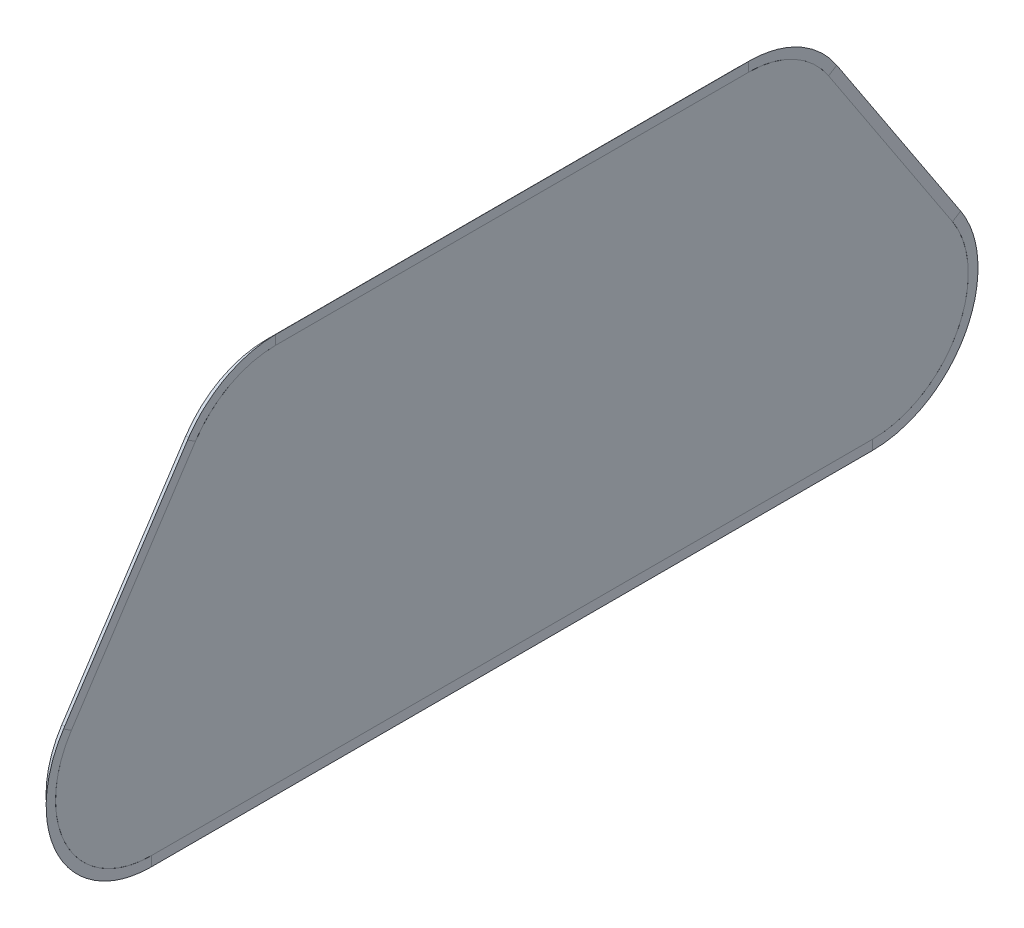
ISO-10303-21;
HEADER;
FILE_DESCRIPTION(('STEP AP214'),'2;1');
FILE_NAME('part.step','',(''),(''),'','','');
FILE_SCHEMA(('AUTOMOTIVE_DESIGN { 1 0 10303 214 1 1 1 1 }'));
ENDSEC;
DATA;
#1=APPLICATION_CONTEXT('core data for automotive mechanical design processes');
#2=APPLICATION_PROTOCOL_DEFINITION('international standard','automotive_design',2000,#1);
#3=PRODUCT_CONTEXT('',#1,'mechanical');
#4=PRODUCT('Part','Part','',(#3));
#5=PRODUCT_RELATED_PRODUCT_CATEGORY('part','',(#4));
#6=PRODUCT_DEFINITION_FORMATION('','',#4);
#7=PRODUCT_DEFINITION_CONTEXT('part definition',#1,'design');
#8=PRODUCT_DEFINITION('design','',#6,#7);
#9=PRODUCT_DEFINITION_SHAPE('','',#8);
#10=(LENGTH_UNIT() NAMED_UNIT(*) SI_UNIT(.MILLI.,.METRE.));
#11=(NAMED_UNIT(*) PLANE_ANGLE_UNIT() SI_UNIT($,.RADIAN.));
#12=(NAMED_UNIT(*) SI_UNIT($,.STERADIAN.) SOLID_ANGLE_UNIT());
#13=UNCERTAINTY_MEASURE_WITH_UNIT(LENGTH_MEASURE(1.E-05),#10,'distance_accuracy_value','');
#14=(GEOMETRIC_REPRESENTATION_CONTEXT(3) GLOBAL_UNCERTAINTY_ASSIGNED_CONTEXT((#13)) GLOBAL_UNIT_ASSIGNED_CONTEXT((#10,
#11,#12)) REPRESENTATION_CONTEXT('',''));
#15=CARTESIAN_POINT('',(0.,0.,0.));
#16=DIRECTION('',(0.,0.,1.));
#17=DIRECTION('',(1.,0.,0.));
#18=AXIS2_PLACEMENT_3D('',#15,#16,#17);
#19=CARTESIAN_POINT('',(222.,47.3671548351233,-10.544114440503));
#20=CARTESIAN_POINT('',(222.034904812875,49.3668502254361,-10.544114440503));
#21=CARTESIAN_POINT('',(222.,47.3671548351233,-10.1469887777139));
#22=CARTESIAN_POINT('',(222.034904812874,49.3593817909838,-10.1075705196872));
#23=CARTESIAN_POINT('',(222.,47.343393296283,-9.34743837210346));
#24=CARTESIAN_POINT('',(222.034904812874,49.3444449220792,-9.23448267805566));
#25=CARTESIAN_POINT('',(222.,47.1980460977618,-7.73366449790399));
#26=CARTESIAN_POINT('',(222.034904812875,49.1802646931181,-7.46443837044333));
#27=CARTESIAN_POINT('',(222.,46.6751620014668,-4.88118267092727));
#28=CARTESIAN_POINT('',(222.034904812874,48.6159810452897,-4.35028259738964));
#29=CARTESIAN_POINT('',(222.,45.1633562274969,-0.959543207699794));
#30=CARTESIAN_POINT('',(222.034904812875,46.9444905687506,-0.000270574594239402));
#31=CARTESIAN_POINT('',(222.,42.7209172377154,2.46088140906158));
#32=CARTESIAN_POINT('',(222.034904812875,44.2322549281824,3.78922317017646));
#33=CARTESIAN_POINT('',(222.,40.6269637317133,4.46722611177145));
#34=CARTESIAN_POINT('',(222.034904812875,41.9425972953211,5.97413738779009));
#35=CARTESIAN_POINT('',(222.,39.3595162459252,5.47666595442486));
#36=CARTESIAN_POINT('',(222.034904812874,40.5550345716577,7.08529970104253));
#37=CARTESIAN_POINT('',(222.,38.7050012510926,5.93650895304427));
#38=CARTESIAN_POINT('',(222.034904812874,39.8342625491415,7.57824308604266));
#39=CARTESIAN_POINT('',(222.,38.373417865557,6.15505242808387));
#40=CARTESIAN_POINT('',(222.034904812875,39.4738765378834,7.82471477854273));
#41=(BOUNDED_SURFACE() B_SPLINE_SURFACE(3,1,((#19,#20),(#21,#22),(#23,#24),(#25,#26),(#27,#28),
(#29,#30),(#31,#32),(#33,#34),(#35,#36),(#37,#38),(#39,#40)),.UNSPECIFIED.,.F.,.F.,
.F.) B_SPLINE_SURFACE_WITH_KNOTS((4,1,1,1,1,1,1,1,4),(2,2),(0.,0.0625,0.125,0.25,0.5,0.75,0.875,
0.9375,1.),(0.,1.),
.UNSPECIFIED.) GEOMETRIC_REPRESENTATION_ITEM() RATIONAL_B_SPLINE_SURFACE(((1.,1.),
(0.995017906985336,1.),(0.985676482582842,1.),(0.969484680285185,1.),(0.947688023346032,1.),
(0.935232790809373,1.),(0.947688023346032,1.),(0.969484680285185,1.),(0.985676482582842,1.),
(0.995017906985336,1.),(1.,1.))) REPRESENTATION_ITEM('') SURFACE());
#42=CARTESIAN_POINT('',(222.,47.3671548351233,-10.544114440503));
#43=CARTESIAN_POINT('',(222.,47.3671548351233,-10.1469887777139));
#44=CARTESIAN_POINT('',(222.,47.343393296283,-9.34743837210346));
#45=CARTESIAN_POINT('',(222.,47.1980460977618,-7.73366449790399));
#46=CARTESIAN_POINT('',(222.,46.6751620014668,-4.88118267092727));
#47=CARTESIAN_POINT('',(222.,45.1633562274969,-0.959543207699794));
#48=CARTESIAN_POINT('',(222.,42.7209172377154,2.46088140906158));
#49=CARTESIAN_POINT('',(222.,40.6269637317133,4.46722611177145));
#50=CARTESIAN_POINT('',(222.,39.3595162459252,5.47666595442486));
#51=CARTESIAN_POINT('',(222.,38.7050012510926,5.93650895304427));
#52=CARTESIAN_POINT('',(222.,38.373417865557,6.15505242808387));
#53=(BOUNDED_CURVE() B_SPLINE_CURVE(3,(#42,#43,#44,#45,#46,#47,#48,#49,#50,#51,#52),
.UNSPECIFIED.,.F.,.F.) B_SPLINE_CURVE_WITH_KNOTS((4,1,1,1,1,1,1,1,4),(0.,0.0625,0.125,0.25,0.5,
0.75,0.875,0.9375,1.),
.UNSPECIFIED.) CURVE() GEOMETRIC_REPRESENTATION_ITEM() RATIONAL_B_SPLINE_CURVE((1.,
0.995017906985336,0.985676482582842,0.969484680285185,0.947688023346032,0.935232790809373,
0.947688023346032,0.969484680285185,0.985676482582842,0.995017906985336,1.)) REPRESENTATION_ITEM(''));
#54=CARTESIAN_POINT('',(222.,47.3671548351233,-10.544114440503));
#55=VERTEX_POINT('',#54);
#56=CARTESIAN_POINT('',(222.,38.373417865557,6.15505242808387));
#57=VERTEX_POINT('',#56);
#58=EDGE_CURVE('E542',#55,#57,#53,.T.);
#59=DIRECTION('',(0.0174524064372739,0.550229336163204,0.834831175229428));
#60=VECTOR('',#59,1.);
#61=CARTESIAN_POINT('',(222.017452406437,38.9236472017202,6.9898836033133));
#62=LINE('',#61,#60);
#63=CARTESIAN_POINT('',(222.034904812875,39.4738765378834,7.82471477854273));
#64=VERTEX_POINT('',#63);
#65=EDGE_CURVE('E525',#57,#64,#62,.T.);
#66=CARTESIAN_POINT('',(222.034904812875,49.3668502254361,-10.544114440503));
#67=CARTESIAN_POINT('',(222.034904812874,49.3593817909838,-10.1075705196872));
#68=CARTESIAN_POINT('',(222.034904812874,49.3444449220792,-9.23448267805566));
#69=CARTESIAN_POINT('',(222.034904812875,49.1802646931181,-7.46443837044333));
#70=CARTESIAN_POINT('',(222.034904812874,48.6159810452897,-4.35028259738964));
#71=CARTESIAN_POINT('',(222.034904812875,46.9444905687506,-0.000270574594239402));
#72=CARTESIAN_POINT('',(222.034904812875,44.2322549281824,3.78922317017646));
#73=CARTESIAN_POINT('',(222.034904812875,41.9425972953211,5.97413738779009));
#74=CARTESIAN_POINT('',(222.034904812874,40.5550345716577,7.08529970104253));
#75=CARTESIAN_POINT('',(222.034904812874,39.8342625491415,7.57824308604266));
#76=CARTESIAN_POINT('',(222.034904812875,39.4738765378834,7.82471477854273));
#77=B_SPLINE_CURVE_WITH_KNOTS('',3,(#66,#67,#68,#69,#70,#71,#72,#73,#74,#75,#76),.UNSPECIFIED.,
.F.,.F.,(4,1,1,1,1,1,1,1,4),(0.,0.0625,0.125,0.25,0.5,0.75,0.875,0.9375,1.),.UNSPECIFIED.);
#78=CARTESIAN_POINT('',(222.034904812875,49.3668502254361,-10.544114440503));
#79=VERTEX_POINT('',#78);
#80=EDGE_CURVE('E370',#64,#79,#77,.F.);
#81=DIRECTION('',(-0.0174524064372738,-0.999847695156391,0.));
#82=VECTOR('',#81,1.);
#83=CARTESIAN_POINT('',(222.017452406437,48.3670025302797,-10.544114440503));
#84=LINE('',#83,#82);
#85=EDGE_CURVE('E13',#79,#55,#84,.T.);
#86=ORIENTED_EDGE('',*,*,#58,.T.);
#87=ORIENTED_EDGE('',*,*,#65,.T.);
#88=ORIENTED_EDGE('',*,*,#80,.T.);
#89=ORIENTED_EDGE('',*,*,#85,.T.);
#90=EDGE_LOOP('',(#86,#87,#88,#89));
#91=FACE_BOUND('',#90,.T.);
#92=ADVANCED_FACE('F357',(#91),#41,.T.);
#93=CARTESIAN_POINT('',(222.,47.3671548351233,-109.327040639233));
#94=DIRECTION('',(-0.999847695156391,0.0174524064372738,0.));
#95=DIRECTION('',(0.,0.,1.));
#96=AXIS2_PLACEMENT_3D('',#93,#94,#95);
#97=PLANE('',#96);
#98=DIRECTION('',(0.,0.,1.));
#99=VECTOR('',#98,1.);
#100=CARTESIAN_POINT('',(222.,47.3671548351233,-59.9355775398678));
#101=LINE('',#100,#99);
#102=CARTESIAN_POINT('',(222.,47.3671548351233,-109.327040639233));
#103=VERTEX_POINT('',#102);
#104=EDGE_CURVE('E379',#103,#55,#101,.T.);
#105=ORIENTED_EDGE('',*,*,#104,.T.);
#106=ORIENTED_EDGE('',*,*,#85,.F.);
#107=DIRECTION('',(0.,0.,-1.));
#108=VECTOR('',#107,1.);
#109=CARTESIAN_POINT('',(222.034904812875,49.3668502254361,-59.9355775398678));
#110=LINE('',#109,#108);
#111=CARTESIAN_POINT('',(222.034904812875,49.3668502254361,-109.327040639233));
#112=VERTEX_POINT('',#111);
#113=EDGE_CURVE('E543',#79,#112,#110,.T.);
#114=ORIENTED_EDGE('',*,*,#113,.T.);
#115=DIRECTION('',(-0.0174524064372738,-0.999847695156391,0.));
#116=VECTOR('',#115,1.);
#117=CARTESIAN_POINT('',(222.017452406437,48.3670025302797,-109.327040639233));
#118=LINE('',#117,#116);
#119=EDGE_CURVE('E538',#112,#103,#118,.T.);
#120=ORIENTED_EDGE('',*,*,#119,.T.);
#121=EDGE_LOOP('',(#105,#106,#114,#120));
#122=FACE_BOUND('',#121,.T.);
#123=ADVANCED_FACE('F625',(#122),#97,.T.);
#124=CARTESIAN_POINT('',(222.,38.373417865557,6.15505242808387));
#125=DIRECTION('',(-0.999847695156391,0.00960428878813346,0.0145720323677218));
#126=DIRECTION('',(0.,-0.834958343429344,0.550313151521682));
#127=AXIS2_PLACEMENT_3D('',#124,#125,#126);
#128=PLANE('',#127);
#129=DIRECTION('',(0.,-0.834958343429344,0.550313151521682));
#130=VECTOR('',#129,1.);
#131=CARTESIAN_POINT('',(222.,18.7230554542372,19.1064205438894));
#132=LINE('',#131,#130);
#133=CARTESIAN_POINT('',(222.,-0.927306957082626,32.0577886596949));
#134=VERTEX_POINT('',#133);
#135=EDGE_CURVE('E502',#57,#134,#132,.T.);
#136=ORIENTED_EDGE('',*,*,#135,.T.);
#137=DIRECTION('',(0.0174524064372738,0.550229336163203,0.834831175229429));
#138=VECTOR('',#137,1.);
#139=CARTESIAN_POINT('',(222.017452406437,-0.377077620919421,32.8926198349243));
#140=LINE('',#139,#138);
#141=CARTESIAN_POINT('',(222.034904812875,0.17315171524378,33.7274510101537));
#142=VERTEX_POINT('',#141);
#143=EDGE_CURVE('E496',#134,#142,#140,.T.);
#144=ORIENTED_EDGE('',*,*,#143,.T.);
#145=DIRECTION('',(0.,0.834958343429344,-0.550313151521682));
#146=VECTOR('',#145,1.);
#147=CARTESIAN_POINT('',(222.034904812875,19.8235141265636,20.7760828943482));
#148=LINE('',#147,#146);
#149=EDGE_CURVE('E501',#142,#64,#148,.T.);
#150=ORIENTED_EDGE('',*,*,#149,.T.);
#151=ORIENTED_EDGE('',*,*,#65,.F.);
#152=EDGE_LOOP('',(#136,#144,#150,#151));
#153=FACE_BOUND('',#152,.T.);
#154=ADVANCED_FACE('F600',(#153),#128,.T.);
#155=CARTESIAN_POINT('',(222.,38.363087517325,-126.033011561286));
#156=CARTESIAN_POINT('',(222.034904812875,39.4625133121644,-127.703354213462));
#157=CARTESIAN_POINT('',(222.,38.69499849861,-125.814546509256));
#158=CARTESIAN_POINT('',(222.034904812875,39.8232582759278,-127.456959217031));
#159=CARTESIAN_POINT('',(222.,39.3501756336238,-125.354826519129));
#160=CARTESIAN_POINT('',(222.034904812874,40.5447482034547,-126.964169224169));
#161=CARTESIAN_POINT('',(222.,40.6189612817587,-124.345493577547));
#162=CARTESIAN_POINT('',(222.034904812875,41.9337732370248,-125.853122734842));
#163=CARTESIAN_POINT('',(222.,42.715265497387,-122.338946246436));
#164=CARTESIAN_POINT('',(222.034904812875,44.2259780773546,-123.668021113326));
#165=CARTESIAN_POINT('',(222.,45.1606374593197,-118.917247405057));
#166=CARTESIAN_POINT('',(222.034904812874,46.9415053144157,-119.877087101067));
#167=CARTESIAN_POINT('',(222.,46.6743202529073,-114.993393254645));
#168=CARTESIAN_POINT('',(222.034904812875,48.615079248456,-115.524568387975));
#169=CARTESIAN_POINT('',(222.,47.1978453194475,-112.139160422315));
#170=CARTESIAN_POINT('',(222.034904812875,49.1800449500906,-112.40853150078));
#171=CARTESIAN_POINT('',(222.,47.3433655793325,-110.524417761134));
#172=CARTESIAN_POINT('',(222.034904812875,49.3444191791267,-110.637431289567));
#173=CARTESIAN_POINT('',(222.,47.3671548351233,-109.724396749612));
#174=CARTESIAN_POINT('',(222.034904812874,49.3593732099996,-109.763837522677));
#175=CARTESIAN_POINT('',(222.,47.3671548351233,-109.327040639233));
#176=CARTESIAN_POINT('',(222.034904812875,49.3668502254361,-109.327040639233));
#177=(BOUNDED_SURFACE() B_SPLINE_SURFACE(3,1,((#155,#156),(#157,#158),(#159,#160),(#161,#162),
(#163,#164),(#165,#166),(#167,#168),(#169,#170),(#171,#172),(#173,#174),(#175,#176)),
.UNSPECIFIED.,.F.,.F.,.F.) B_SPLINE_SURFACE_WITH_KNOTS((4,1,1,1,1,1,1,1,4),(2,2),(0.,0.0625,
0.125,0.25,0.5,0.75,0.875,0.9375,1.),(0.,1.),
.UNSPECIFIED.) GEOMETRIC_REPRESENTATION_ITEM() RATIONAL_B_SPLINE_SURFACE(((1.,1.),
(0.995011795381524,1.),(0.985658911721881,1.),(0.969447246711834,1.),(0.947623851506001,1.),
(0.935153339959811,1.),(0.947623851506001,1.),(0.969447246711834,1.),(0.985658911721881,1.),
(0.995011795381524,1.),(1.,1.))) REPRESENTATION_ITEM('') SURFACE());
#178=CARTESIAN_POINT('',(222.,38.363087517325,-126.033011561286));
#179=CARTESIAN_POINT('',(222.,38.69499849861,-125.814546509256));
#180=CARTESIAN_POINT('',(222.,39.3501756336238,-125.354826519129));
#181=CARTESIAN_POINT('',(222.,40.6189612817587,-124.345493577547));
#182=CARTESIAN_POINT('',(222.,42.715265497387,-122.338946246436));
#183=CARTESIAN_POINT('',(222.,45.1606374593197,-118.917247405057));
#184=CARTESIAN_POINT('',(222.,46.6743202529073,-114.993393254645));
#185=CARTESIAN_POINT('',(222.,47.1978453194475,-112.139160422315));
#186=CARTESIAN_POINT('',(222.,47.3433655793325,-110.524417761134));
#187=CARTESIAN_POINT('',(222.,47.3671548351233,-109.724396749612));
#188=CARTESIAN_POINT('',(222.,47.3671548351233,-109.327040639233));
#189=(BOUNDED_CURVE() B_SPLINE_CURVE(3,(#178,#179,#180,#181,#182,#183,#184,#185,#186,#187,#188),
.UNSPECIFIED.,.F.,.F.) B_SPLINE_CURVE_WITH_KNOTS((4,1,1,1,1,1,1,1,4),(0.,0.0625,0.125,0.25,0.5,
0.75,0.875,0.9375,1.),
.UNSPECIFIED.) CURVE() GEOMETRIC_REPRESENTATION_ITEM() RATIONAL_B_SPLINE_CURVE((1.,
0.995011795381524,0.985658911721881,0.969447246711834,0.947623851506001,0.935153339959811,
0.947623851506001,0.969447246711834,0.985658911721881,0.995011795381524,1.)) REPRESENTATION_ITEM(''));
#190=CARTESIAN_POINT('',(222.,38.363087517325,-126.033011561286));
#191=VERTEX_POINT('',#190);
#192=EDGE_CURVE('E533',#191,#103,#189,.T.);
#193=CARTESIAN_POINT('',(222.034904812875,39.4625133121644,-127.703354213462));
#194=CARTESIAN_POINT('',(222.034904812875,39.8232582759278,-127.456959217031));
#195=CARTESIAN_POINT('',(222.034904812874,40.5447482034547,-126.964169224169));
#196=CARTESIAN_POINT('',(222.034904812875,41.9337732370248,-125.853122734842));
#197=CARTESIAN_POINT('',(222.034904812875,44.2259780773546,-123.668021113326));
#198=CARTESIAN_POINT('',(222.034904812874,46.9415053144157,-119.877087101067));
#199=CARTESIAN_POINT('',(222.034904812875,48.615079248456,-115.524568387975));
#200=CARTESIAN_POINT('',(222.034904812875,49.1800449500906,-112.40853150078));
#201=CARTESIAN_POINT('',(222.034904812875,49.3444191791267,-110.637431289567));
#202=CARTESIAN_POINT('',(222.034904812874,49.3593732099996,-109.763837522677));
#203=CARTESIAN_POINT('',(222.034904812875,49.3668502254361,-109.327040639233));
#204=B_SPLINE_CURVE_WITH_KNOTS('',3,(#193,#194,#195,#196,#197,#198,#199,#200,#201,#202,#203),
.UNSPECIFIED.,.F.,.F.,(4,1,1,1,1,1,1,1,4),(0.,0.0625,0.125,0.25,0.5,0.75,0.875,0.9375,1.),.UNSPECIFIED.);
#205=CARTESIAN_POINT('',(222.034904812875,39.4625133121644,-127.703354213462));
#206=VERTEX_POINT('',#205);
#207=EDGE_CURVE('E519',#112,#206,#204,.F.);
#208=DIRECTION('',(-0.0174524064372738,-0.549712897419708,0.835171326088233));
#209=VECTOR('',#208,1.);
#210=CARTESIAN_POINT('',(222.017452406437,38.9128004147447,-126.868182887374));
#211=LINE('',#210,#209);
#212=EDGE_CURVE('E514',#206,#191,#211,.T.);
#213=ORIENTED_EDGE('',*,*,#192,.T.);
#214=ORIENTED_EDGE('',*,*,#119,.F.);
#215=ORIENTED_EDGE('',*,*,#207,.T.);
#216=ORIENTED_EDGE('',*,*,#212,.T.);
#217=EDGE_LOOP('',(#213,#214,#215,#216));
#218=FACE_BOUND('',#217,.T.);
#219=ADVANCED_FACE('F628',(#218),#177,.T.);
#220=CARTESIAN_POINT('',(222.,-0.927306957082628,32.0577886596949));
#221=CARTESIAN_POINT('',(222.034904812875,0.173151715243778,33.7274510101538));
#222=CARTESIAN_POINT('',(222.,-1.23700045082469,32.2619047139725));
#223=CARTESIAN_POINT('',(222.034904812875,-0.170527520574555,33.9462644650517));
#224=CARTESIAN_POINT('',(222.,-1.87783972208461,32.6592954713684));
#225=CARTESIAN_POINT('',(222.034904812874,-0.857885992211221,34.3838913748478));
#226=CARTESIAN_POINT('',(222.,-3.24535558673677,33.4032483997321));
#227=CARTESIAN_POINT('',(222.034904812875,-2.35065421671441,35.1921869706594));
#228=CARTESIAN_POINT('',(222.,-5.91388253844429,34.5625296931835));
#229=CARTESIAN_POINT('',(222.034904812874,-5.19452333340102,36.4389795747554));
#230=CARTESIAN_POINT('',(222.,-10.2620671226155,35.5419502335157));
#231=CARTESIAN_POINT('',(222.034904812875,-9.92582557205841,37.5469244069014));
#232=CARTESIAN_POINT('',(222.,-15.958109396507,35.2419578031619));
#233=CARTESIAN_POINT('',(222.034904812874,-16.2663222258485,37.2530404115033));
#234=CARTESIAN_POINT('',(222.,-21.5591015638545,33.2308765097019));
#235=CARTESIAN_POINT('',(222.034904812875,-22.5238530027403,35.0221836514583));
#236=CARTESIAN_POINT('',(222.,-26.3205703204049,29.6610058526629));
#237=CARTESIAN_POINT('',(222.034904812875,-27.8301269501109,31.0250759342404));
#238=CARTESIAN_POINT('',(222.,-29.7056584780405,25.0701376113316));
#239=CARTESIAN_POINT('',(222.034904812875,-31.5647665398288,25.8927535793619));
#240=CARTESIAN_POINT('',(222.,-31.2807462880772,20.9005966097917));
#241=CARTESIAN_POINT('',(222.034904812874,-33.2433766039262,21.3325966876185));
#242=CARTESIAN_POINT('',(222.,-31.7813201764431,18.0345200246981));
#243=CARTESIAN_POINT('',(222.034904812875,-33.7673752927291,18.2719580737659));
#244=CARTESIAN_POINT('',(222.,-31.9127124370198,16.4832941631432));
#245=CARTESIAN_POINT('',(222.034904812875,-33.9139721271669,16.5807430932186));
#246=CARTESIAN_POINT('',(222.,-31.9335699875163,15.7295307067194));
#247=CARTESIAN_POINT('',(222.034904812875,-33.926834294275,15.7659955584782));
#248=CARTESIAN_POINT('',(222.,-31.9335699875163,15.358621791108));
#249=CARTESIAN_POINT('',(222.034904812875,-33.933265377829,15.358621791108));
#250=(BOUNDED_SURFACE() B_SPLINE_SURFACE(3,1,((#220,#221),(#222,#223),(#224,#225),(#226,#227),
(#228,#229),(#230,#231),(#232,#233),(#234,#235),(#236,#237),(#238,#239),(#240,#241),(#242,#243),
(#244,#245),(#246,#247),(#248,#249)),.UNSPECIFIED.,.F.,.F.,.F.) B_SPLINE_SURFACE_WITH_KNOTS((4,
1,1,1,1,1,1,1,1,1,1,1,4),(2,2),(0.,0.03125,0.0625,0.125,0.25,0.375,0.5,0.625,0.75,0.875,0.9375,
0.96875,1.),(0.,1.),
.UNSPECIFIED.) GEOMETRIC_REPRESENTATION_ITEM() RATIONAL_B_SPLINE_SURFACE(((1.,1.),
(0.989045345311631,1.),(0.967820701852915,1.),(0.928110078607576,1.),(0.865805480067476,1.),
(0.797338888265168,1.),(0.748042942167506,1.),(0.731610960134952,1.),(0.748042942167506,1.),
(0.797338888265168,1.),(0.865805480067476,1.),(0.928110078607577,1.),(0.967820701852915,1.),
(0.989045345311631,1.),(1.,1.))) REPRESENTATION_ITEM('') SURFACE());
#251=CARTESIAN_POINT('',(222.,-0.927306957082628,32.0577886596949));
#252=CARTESIAN_POINT('',(222.,-1.23700045082469,32.2619047139725));
#253=CARTESIAN_POINT('',(222.,-1.87783972208461,32.6592954713684));
#254=CARTESIAN_POINT('',(222.,-3.24535558673677,33.4032483997321));
#255=CARTESIAN_POINT('',(222.,-5.91388253844429,34.5625296931835));
#256=CARTESIAN_POINT('',(222.,-10.2620671226155,35.5419502335157));
#257=CARTESIAN_POINT('',(222.,-15.958109396507,35.2419578031619));
#258=CARTESIAN_POINT('',(222.,-21.5591015638545,33.2308765097019));
#259=CARTESIAN_POINT('',(222.,-26.3205703204049,29.6610058526629));
#260=CARTESIAN_POINT('',(222.,-29.7056584780405,25.0701376113316));
#261=CARTESIAN_POINT('',(222.,-31.2807462880772,20.9005966097917));
#262=CARTESIAN_POINT('',(222.,-31.7813201764431,18.0345200246981));
#263=CARTESIAN_POINT('',(222.,-31.9127124370198,16.4832941631432));
#264=CARTESIAN_POINT('',(222.,-31.9335699875163,15.7295307067194));
#265=CARTESIAN_POINT('',(222.,-31.9335699875163,15.358621791108));
#266=(BOUNDED_CURVE() B_SPLINE_CURVE(3,(#251,#252,#253,#254,#255,#256,#257,#258,#259,#260,#261,
#262,#263,#264,#265),.UNSPECIFIED.,.F.,.F.) B_SPLINE_CURVE_WITH_KNOTS((4,1,1,1,1,1,1,1,1,1,1,1,
4),(0.,0.03125,0.0625,0.125,0.25,0.375,0.5,0.625,0.75,0.875,0.9375,0.96875,1.),
.UNSPECIFIED.) CURVE() GEOMETRIC_REPRESENTATION_ITEM() RATIONAL_B_SPLINE_CURVE((1.,
0.989045345311631,0.967820701852915,0.928110078607576,0.865805480067476,0.797338888265168,
0.748042942167506,0.731610960134952,0.748042942167506,0.797338888265168,0.865805480067476,
0.928110078607577,0.967820701852915,0.989045345311631,1.)) REPRESENTATION_ITEM(''));
#267=CARTESIAN_POINT('',(222.,-31.9335699875163,15.358621791108));
#268=VERTEX_POINT('',#267);
#269=EDGE_CURVE('E463',#134,#268,#266,.T.);
#270=DIRECTION('',(0.0174524064372738,-0.999847695156391,0.));
#271=VECTOR('',#270,1.);
#272=CARTESIAN_POINT('',(222.017452406437,-32.9334176826726,15.358621791108));
#273=LINE('',#272,#271);
#274=CARTESIAN_POINT('',(222.034904812875,-33.933265377829,15.358621791108));
#275=VERTEX_POINT('',#274);
#276=EDGE_CURVE('E470',#268,#275,#273,.T.);
#277=CARTESIAN_POINT('',(222.034904812875,0.173151715243778,33.7274510101538));
#278=CARTESIAN_POINT('',(222.034904812875,-0.170527520574555,33.9462644650517));
#279=CARTESIAN_POINT('',(222.034904812874,-0.857885992211221,34.3838913748478));
#280=CARTESIAN_POINT('',(222.034904812875,-2.35065421671441,35.1921869706594));
#281=CARTESIAN_POINT('',(222.034904812874,-5.19452333340102,36.4389795747554));
#282=CARTESIAN_POINT('',(222.034904812875,-9.92582557205841,37.5469244069014));
#283=CARTESIAN_POINT('',(222.034904812874,-16.2663222258485,37.2530404115033));
#284=CARTESIAN_POINT('',(222.034904812875,-22.5238530027403,35.0221836514583));
#285=CARTESIAN_POINT('',(222.034904812875,-27.8301269501109,31.0250759342404));
#286=CARTESIAN_POINT('',(222.034904812875,-31.5647665398288,25.8927535793619));
#287=CARTESIAN_POINT('',(222.034904812874,-33.2433766039262,21.3325966876185));
#288=CARTESIAN_POINT('',(222.034904812875,-33.7673752927291,18.2719580737659));
#289=CARTESIAN_POINT('',(222.034904812875,-33.9139721271669,16.5807430932186));
#290=CARTESIAN_POINT('',(222.034904812875,-33.926834294275,15.7659955584782));
#291=CARTESIAN_POINT('',(222.034904812875,-33.933265377829,15.358621791108));
#292=B_SPLINE_CURVE_WITH_KNOTS('',3,(#277,#278,#279,#280,#281,#282,#283,#284,#285,#286,#287,
#288,#289,#290,#291),.UNSPECIFIED.,.F.,.F.,(4,1,1,1,1,1,1,1,1,1,1,1,4),(0.,0.03125,0.0625,0.125,
0.25,0.375,0.5,0.625,0.75,0.875,0.9375,0.96875,1.),.UNSPECIFIED.);
#293=EDGE_CURVE('E483',#275,#142,#292,.F.);
#294=ORIENTED_EDGE('',*,*,#269,.T.);
#295=ORIENTED_EDGE('',*,*,#276,.T.);
#296=ORIENTED_EDGE('',*,*,#293,.T.);
#297=ORIENTED_EDGE('',*,*,#143,.F.);
#298=EDGE_LOOP('',(#294,#295,#296,#297));
#299=FACE_BOUND('',#298,.T.);
#300=ADVANCED_FACE('F597',(#299),#250,.T.);
#301=CARTESIAN_POINT('',(222.,-0.937637305314603,-151.900895955901));
#302=DIRECTION('',(-0.999847695156391,0.00959527431633429,-0.0145779697230476));
#303=DIRECTION('',(0.,0.835298546102664,0.549796634110083));
#304=AXIS2_PLACEMENT_3D('',#301,#302,#303);
#305=PLANE('',#304);
#306=DIRECTION('',(0.,0.835298546102664,0.549796634110083));
#307=VECTOR('',#306,1.);
#308=CARTESIAN_POINT('',(222.,18.7127251060052,-138.966953758593));
#309=LINE('',#308,#307);
#310=CARTESIAN_POINT('',(222.,-0.937637305314609,-151.900895955901));
#311=VERTEX_POINT('',#310);
#312=EDGE_CURVE('E439',#311,#191,#309,.T.);
#313=ORIENTED_EDGE('',*,*,#312,.T.);
#314=ORIENTED_EDGE('',*,*,#212,.F.);
#315=DIRECTION('',(0.,-0.835298546102664,-0.549796634110083));
#316=VECTOR('',#315,1.);
#317=CARTESIAN_POINT('',(222.034904812875,19.8121509008446,-140.63729641077));
#318=LINE('',#317,#316);
#319=CARTESIAN_POINT('',(222.034904812875,0.161788489524807,-153.571238608077));
#320=VERTEX_POINT('',#319);
#321=EDGE_CURVE('E446',#206,#320,#318,.T.);
#322=ORIENTED_EDGE('',*,*,#321,.T.);
#323=DIRECTION('',(-0.0174524064372738,-0.549712897419707,0.835171326088234));
#324=VECTOR('',#323,1.);
#325=CARTESIAN_POINT('',(222.017452406437,-0.387924407894895,-152.736067281989));
#326=LINE('',#325,#324);
#327=EDGE_CURVE('E424',#320,#311,#326,.T.);
#328=ORIENTED_EDGE('',*,*,#327,.T.);
#329=EDGE_LOOP('',(#313,#314,#322,#328));
#330=FACE_BOUND('',#329,.T.);
#331=ADVANCED_FACE('F461',(#330),#305,.T.);
#332=CARTESIAN_POINT('',(222.,-31.9335699875163,15.358621791108));
#333=DIRECTION('',(-0.999847695156391,-0.0174524064372738,0.));
#334=DIRECTION('',(0.,0.,-1.));
#335=AXIS2_PLACEMENT_3D('',#332,#333,#334);
#336=PLANE('',#335);
#337=DIRECTION('',(0.,0.,-1.));
#338=VECTOR('',#337,1.);
#339=CARTESIAN_POINT('',(222.,-31.9335699875163,-59.9181516213698));
#340=LINE('',#339,#338);
#341=CARTESIAN_POINT('',(222.,-31.9335699875162,-135.194925033848));
#342=VERTEX_POINT('',#341);
#343=EDGE_CURVE('E427',#268,#342,#340,.T.);
#344=ORIENTED_EDGE('',*,*,#343,.T.);
#345=DIRECTION('',(0.0174524064372738,-0.999847695156391,0.));
#346=VECTOR('',#345,1.);
#347=CARTESIAN_POINT('',(222.017452406437,-32.9334176826726,-135.194925033848));
#348=LINE('',#347,#346);
#349=CARTESIAN_POINT('',(222.034904812875,-33.933265377829,-135.194925033848));
#350=VERTEX_POINT('',#349);
#351=EDGE_CURVE('E420',#342,#350,#348,.T.);
#352=ORIENTED_EDGE('',*,*,#351,.T.);
#353=DIRECTION('',(0.,0.,1.));
#354=VECTOR('',#353,1.);
#355=CARTESIAN_POINT('',(222.034904812875,-33.933265377829,-59.9181516213698));
#356=LINE('',#355,#354);
#357=EDGE_CURVE('E433',#350,#275,#356,.T.);
#358=ORIENTED_EDGE('',*,*,#357,.T.);
#359=ORIENTED_EDGE('',*,*,#276,.F.);
#360=EDGE_LOOP('',(#344,#352,#358,#359));
#361=FACE_BOUND('',#360,.T.);
#362=ADVANCED_FACE('F432',(#361),#336,.T.);
#363=CARTESIAN_POINT('',(222.,-31.9335699875162,-135.194925033848));
#364=CARTESIAN_POINT('',(222.034904812875,-33.933265377829,-135.194925033848));
#365=CARTESIAN_POINT('',(222.,-31.9335699875162,-135.565770029854));
#366=CARTESIAN_POINT('',(222.034904812874,-33.9268364314302,-135.602228940231));
#367=CARTESIAN_POINT('',(222.,-31.9127197450569,-136.319397127786));
#368=CARTESIAN_POINT('',(222.034904812874,-33.9139785386324,-136.416836752997));
#369=CARTESIAN_POINT('',(222.,-31.7813770050345,-137.870317242572));
#370=CARTESIAN_POINT('',(222.034904812875,-33.7674353396959,-138.107727447642));
#371=CARTESIAN_POINT('',(222.,-31.2810161553753,-140.735733758693));
#372=CARTESIAN_POINT('',(222.034904812874,-33.2436457932899,-141.167717669541));
#373=CARTESIAN_POINT('',(222.,-29.7066938021391,-144.904234003329));
#374=CARTESIAN_POINT('',(222.034904812875,-31.5658099993683,-145.726761999622));
#375=CARTESIAN_POINT('',(222.,-26.3234187533581,-149.494168052931));
#376=CARTESIAN_POINT('',(222.034904812874,-27.8331716112333,-150.857977791471));
#377=CARTESIAN_POINT('',(222.,-21.5645274661675,-153.064015735984));
#378=CARTESIAN_POINT('',(222.034904812875,-22.529819429199,-154.854999620991));
#379=CARTESIAN_POINT('',(222.,-15.9662164749122,-155.076420468807));
#380=CARTESIAN_POINT('',(222.034904812875,-16.2753477270775,-157.08733283978));
#381=CARTESIAN_POINT('',(222.,-10.2721380024839,-155.37893490686));
#382=CARTESIAN_POINT('',(222.034904812875,-9.93705861426012,-157.384075087265));
#383=CARTESIAN_POINT('',(222.,-5.9246386778977,-154.402136675828));
#384=CARTESIAN_POINT('',(222.034904812874,-5.20642704163821,-156.279021659089));
#385=CARTESIAN_POINT('',(222.,-3.25606371701974,-153.244691010188));
#386=CARTESIAN_POINT('',(222.034904812875,-2.36244392860212,-155.034169981257));
#387=CARTESIAN_POINT('',(222.,-1.8883706036391,-152.501710751087));
#388=CARTESIAN_POINT('',(222.034904812874,-0.869476432219683,-154.226931289706));
#389=CARTESIAN_POINT('',(222.,-1.24740359130848,-152.104785286482));
#390=CARTESIAN_POINT('',(222.034904812875,-0.181966484390027,-153.789802835287));
#391=CARTESIAN_POINT('',(222.,-0.937637305314614,-151.900895955901));
#392=CARTESIAN_POINT('',(222.034904812875,0.161788489524801,-153.571238608077));
#393=(BOUNDED_SURFACE() B_SPLINE_SURFACE(3,1,((#363,#364),(#365,#366),(#367,#368),(#369,#370),
(#371,#372),(#373,#374),(#375,#376),(#377,#378),(#379,#380),(#381,#382),(#383,#384),(#385,#386),
(#387,#388),(#389,#390),(#391,#392)),.UNSPECIFIED.,.F.,.F.,.F.) B_SPLINE_SURFACE_WITH_KNOTS((4,
1,1,1,1,1,1,1,1,1,1,1,4),(2,2),(0.,0.03125,0.0625,0.125,0.25,0.375,0.5,0.625,0.75,0.875,0.9375,
0.96875,1.),(0.,1.),
.UNSPECIFIED.) GEOMETRIC_REPRESENTATION_ITEM() RATIONAL_B_SPLINE_SURFACE(((1.,1.),
(0.989051017086529,1.),(0.96783736269168,1.),(0.928147299630349,1.),(0.865874959309984,1.),
(0.797443816100792,1.),(0.748173392990174,1.),(0.731749918619968,1.),(0.748173392990174,1.),
(0.797443816100792,1.),(0.865874959309984,1.),(0.928147299630348,1.),(0.96783736269168,1.),
(0.989051017086529,1.),(1.,1.))) REPRESENTATION_ITEM('') SURFACE());
#394=CARTESIAN_POINT('',(222.,-31.9335699875162,-135.194925033848));
#395=CARTESIAN_POINT('',(222.,-31.9335699875162,-135.565770029854));
#396=CARTESIAN_POINT('',(222.,-31.9127197450569,-136.319397127786));
#397=CARTESIAN_POINT('',(222.,-31.7813770050345,-137.870317242572));
#398=CARTESIAN_POINT('',(222.,-31.2810161553753,-140.735733758693));
#399=CARTESIAN_POINT('',(222.,-29.7066938021391,-144.904234003329));
#400=CARTESIAN_POINT('',(222.,-26.3234187533581,-149.494168052931));
#401=CARTESIAN_POINT('',(222.,-21.5645274661675,-153.064015735984));
#402=CARTESIAN_POINT('',(222.,-15.9662164749122,-155.076420468807));
#403=CARTESIAN_POINT('',(222.,-10.2721380024839,-155.37893490686));
#404=CARTESIAN_POINT('',(222.,-5.9246386778977,-154.402136675828));
#405=CARTESIAN_POINT('',(222.,-3.25606371701974,-153.244691010188));
#406=CARTESIAN_POINT('',(222.,-1.8883706036391,-152.501710751087));
#407=CARTESIAN_POINT('',(222.,-1.24740359130848,-152.104785286482));
#408=CARTESIAN_POINT('',(222.,-0.937637305314614,-151.900895955901));
#409=(BOUNDED_CURVE() B_SPLINE_CURVE(3,(#394,#395,#396,#397,#398,#399,#400,#401,#402,#403,#404,
#405,#406,#407,#408),.UNSPECIFIED.,.F.,.F.) B_SPLINE_CURVE_WITH_KNOTS((4,1,1,1,1,1,1,1,1,1,1,1,
4),(0.,0.03125,0.0625,0.125,0.25,0.375,0.5,0.625,0.75,0.875,0.9375,0.96875,1.),
.UNSPECIFIED.) CURVE() GEOMETRIC_REPRESENTATION_ITEM() RATIONAL_B_SPLINE_CURVE((1.,
0.989051017086529,0.96783736269168,0.928147299630349,0.865874959309984,0.797443816100792,
0.748173392990174,0.731749918619968,0.748173392990174,0.797443816100792,0.865874959309984,
0.928147299630348,0.96783736269168,0.989051017086529,1.)) REPRESENTATION_ITEM(''));
#410=EDGE_CURVE('E428',#342,#311,#409,.T.);
#411=CARTESIAN_POINT('',(222.034904812875,-33.933265377829,-135.194925033848));
#412=CARTESIAN_POINT('',(222.034904812874,-33.9268364314302,-135.602228940231));
#413=CARTESIAN_POINT('',(222.034904812874,-33.9139785386324,-136.416836752997));
#414=CARTESIAN_POINT('',(222.034904812875,-33.7674353396959,-138.107727447642));
#415=CARTESIAN_POINT('',(222.034904812874,-33.2436457932899,-141.167717669541));
#416=CARTESIAN_POINT('',(222.034904812875,-31.5658099993683,-145.726761999622));
#417=CARTESIAN_POINT('',(222.034904812874,-27.8331716112333,-150.857977791471));
#418=CARTESIAN_POINT('',(222.034904812875,-22.529819429199,-154.854999620991));
#419=CARTESIAN_POINT('',(222.034904812875,-16.2753477270775,-157.08733283978));
#420=CARTESIAN_POINT('',(222.034904812875,-9.93705861426012,-157.384075087265));
#421=CARTESIAN_POINT('',(222.034904812874,-5.20642704163821,-156.279021659089));
#422=CARTESIAN_POINT('',(222.034904812875,-2.36244392860212,-155.034169981257));
#423=CARTESIAN_POINT('',(222.034904812874,-0.869476432219683,-154.226931289706));
#424=CARTESIAN_POINT('',(222.034904812875,-0.181966484390027,-153.789802835287));
#425=CARTESIAN_POINT('',(222.034904812875,0.161788489524801,-153.571238608077));
#426=B_SPLINE_CURVE_WITH_KNOTS('',3,(#411,#412,#413,#414,#415,#416,#417,#418,#419,#420,#421,
#422,#423,#424,#425),.UNSPECIFIED.,.F.,.F.,(4,1,1,1,1,1,1,1,1,1,1,1,4),(0.,0.03125,0.0625,0.125,
0.25,0.375,0.5,0.625,0.75,0.875,0.9375,0.96875,1.),.UNSPECIFIED.);
#427=EDGE_CURVE('E362',#320,#350,#426,.F.);
#428=ORIENTED_EDGE('',*,*,#410,.T.);
#429=ORIENTED_EDGE('',*,*,#327,.F.);
#430=ORIENTED_EDGE('',*,*,#427,.T.);
#431=ORIENTED_EDGE('',*,*,#351,.F.);
#432=EDGE_LOOP('',(#428,#429,#430,#431));
#433=FACE_BOUND('',#432,.T.);
#434=ADVANCED_FACE('F358',(#433),#393,.T.);
#435=OPEN_SHELL('',(#92,#123,#154,#219,#300,#331,#362,#434));
#436=SHELL_BASED_SURFACE_MODEL('B2',(#435));
#437=CARTESIAN_POINT('',(220.,27.3671548351233,-109.327040639233));
#438=DIRECTION('',(1.,0.,0.));
#439=DIRECTION('',(0.,0.,-1.));
#440=AXIS2_PLACEMENT_3D('',#437,#438,#439);
#441=CYLINDRICAL_SURFACE('',#440,20.);
#442=DIRECTION('',(1.,0.,0.));
#443=VECTOR('',#442,1.);
#444=CARTESIAN_POINT('',(220.,38.363087517325,-126.033011561286));
#445=LINE('',#444,#443);
#446=CARTESIAN_POINT('',(220.,38.363087517325,-126.033011561286));
#447=VERTEX_POINT('',#446);
#448=CARTESIAN_POINT('',(222.,38.363087517325,-126.033011561286));
#449=VERTEX_POINT('',#448);
#450=EDGE_CURVE('E355',#447,#449,#445,.T.);
#451=ORIENTED_EDGE('',*,*,#450,.F.);
#452=CARTESIAN_POINT('',(220.,27.3671548351233,-109.327040639233));
#453=DIRECTION('',(1.,0.,0.));
#454=DIRECTION('',(0.,0.,-1.));
#455=AXIS2_PLACEMENT_3D('',#452,#453,#454);
#456=CIRCLE('',#455,20.);
#457=CARTESIAN_POINT('',(220.,47.3671548351233,-109.327040639233));
#458=VERTEX_POINT('',#457);
#459=EDGE_CURVE('E828',#447,#458,#456,.T.);
#460=ORIENTED_EDGE('',*,*,#459,.T.);
#461=DIRECTION('',(1.,0.,0.));
#462=VECTOR('',#461,1.);
#463=CARTESIAN_POINT('',(220.,47.3671548351233,-109.327040639233));
#464=LINE('',#463,#462);
#465=CARTESIAN_POINT('',(222.,47.3671548351233,-109.327040639233));
#466=VERTEX_POINT('',#465);
#467=EDGE_CURVE('E737',#458,#466,#464,.T.);
#468=ORIENTED_EDGE('',*,*,#467,.T.);
#469=CARTESIAN_POINT('',(222.,27.3671548351233,-109.327040639233));
#470=DIRECTION('',(1.,0.,0.));
#471=DIRECTION('',(0.,0.,-1.));
#472=AXIS2_PLACEMENT_3D('',#469,#470,#471);
#473=CIRCLE('',#472,20.);
#474=EDGE_CURVE('E827',#449,#466,#473,.T.);
#475=ORIENTED_EDGE('',*,*,#474,.F.);
#476=EDGE_LOOP('',(#451,#460,#468,#475));
#477=FACE_BOUND('',#476,.T.);
#478=ADVANCED_FACE('F727',(#477),#441,.T.);
#479=CARTESIAN_POINT('',(220.,47.3671548351233,-10.544114440503));
#480=DIRECTION('',(0.,1.,0.));
#481=DIRECTION('',(0.,0.,1.));
#482=AXIS2_PLACEMENT_3D('',#479,#480,#481);
#483=PLANE('',#482);
#484=ORIENTED_EDGE('',*,*,#467,.F.);
#485=DIRECTION('',(0.,0.,1.));
#486=VECTOR('',#485,1.);
#487=CARTESIAN_POINT('',(220.,47.3671548351233,-10.544114440503));
#488=LINE('',#487,#486);
#489=CARTESIAN_POINT('',(220.,47.3671548351233,-10.544114440503));
#490=VERTEX_POINT('',#489);
#491=EDGE_CURVE('E852',#458,#490,#488,.T.);
#492=ORIENTED_EDGE('',*,*,#491,.T.);
#493=DIRECTION('',(1.,0.,0.));
#494=VECTOR('',#493,1.);
#495=CARTESIAN_POINT('',(220.,47.3671548351233,-10.544114440503));
#496=LINE('',#495,#494);
#497=CARTESIAN_POINT('',(222.,47.3671548351233,-10.544114440503));
#498=VERTEX_POINT('',#497);
#499=EDGE_CURVE('E821',#490,#498,#496,.T.);
#500=ORIENTED_EDGE('',*,*,#499,.T.);
#501=DIRECTION('',(0.,0.,-1.));
#502=VECTOR('',#501,1.);
#503=CARTESIAN_POINT('',(222.,47.3671548351233,-135.194925033848));
#504=LINE('',#503,#502);
#505=EDGE_CURVE('E838',#466,#498,#504,.F.);
#506=ORIENTED_EDGE('',*,*,#505,.F.);
#507=EDGE_LOOP('',(#484,#492,#500,#506));
#508=FACE_BOUND('',#507,.T.);
#509=ADVANCED_FACE('F842',(#508),#483,.T.);
#510=CARTESIAN_POINT('',(220.,27.3671548351233,-10.544114440503));
#511=DIRECTION('',(1.,0.,0.));
#512=DIRECTION('',(0.,0.,-1.));
#513=AXIS2_PLACEMENT_3D('',#510,#511,#512);
#514=CYLINDRICAL_SURFACE('',#513,20.);
#515=ORIENTED_EDGE('',*,*,#499,.F.);
#516=CARTESIAN_POINT('',(220.,27.3671548351233,-10.544114440503));
#517=DIRECTION('',(1.,0.,0.));
#518=DIRECTION('',(0.,0.,-1.));
#519=AXIS2_PLACEMENT_3D('',#516,#517,#518);
#520=CIRCLE('',#519,20.);
#521=CARTESIAN_POINT('',(220.,38.373417865557,6.15505242808387));
#522=VERTEX_POINT('',#521);
#523=EDGE_CURVE('E854',#490,#522,#520,.T.);
#524=ORIENTED_EDGE('',*,*,#523,.T.);
#525=DIRECTION('',(1.,0.,0.));
#526=VECTOR('',#525,1.);
#527=CARTESIAN_POINT('',(220.,38.373417865557,6.15505242808387));
#528=LINE('',#527,#526);
#529=CARTESIAN_POINT('',(222.,38.373417865557,6.15505242808387));
#530=VERTEX_POINT('',#529);
#531=EDGE_CURVE('E819',#522,#530,#528,.T.);
#532=ORIENTED_EDGE('',*,*,#531,.T.);
#533=CARTESIAN_POINT('',(222.,27.3671548351233,-10.544114440503));
#534=DIRECTION('',(1.,0.,0.));
#535=DIRECTION('',(0.,0.,-1.));
#536=AXIS2_PLACEMENT_3D('',#533,#534,#535);
#537=CIRCLE('',#536,20.);
#538=EDGE_CURVE('E843',#498,#530,#537,.T.);
#539=ORIENTED_EDGE('',*,*,#538,.F.);
#540=EDGE_LOOP('',(#515,#524,#532,#539));
#541=FACE_BOUND('',#540,.T.);
#542=ADVANCED_FACE('F864',(#541),#514,.T.);
#543=CARTESIAN_POINT('',(220.,38.373417865557,6.15505242808387));
#544=DIRECTION('',(0.,0.550313151521682,0.834958343429344));
#545=DIRECTION('',(0.,-0.834958343429344,0.550313151521682));
#546=AXIS2_PLACEMENT_3D('',#543,#544,#545);
#547=PLANE('',#546);
#548=ORIENTED_EDGE('',*,*,#531,.F.);
#549=DIRECTION('',(0.,-0.834958343429344,0.550313151521682));
#550=VECTOR('',#549,1.);
#551=CARTESIAN_POINT('',(220.,38.373417865557,6.15505242808387));
#552=LINE('',#551,#550);
#553=CARTESIAN_POINT('',(220.,-0.927306957082622,32.0577886596949));
#554=VERTEX_POINT('',#553);
#555=EDGE_CURVE('E812',#522,#554,#552,.T.);
#556=ORIENTED_EDGE('',*,*,#555,.T.);
#557=DIRECTION('',(1.,0.,0.));
#558=VECTOR('',#557,1.);
#559=CARTESIAN_POINT('',(220.,-0.927306957082622,32.0577886596949));
#560=LINE('',#559,#558);
#561=CARTESIAN_POINT('',(222.,-0.927306957082622,32.0577886596949));
#562=VERTEX_POINT('',#561);
#563=EDGE_CURVE('E817',#554,#562,#560,.T.);
#564=ORIENTED_EDGE('',*,*,#563,.T.);
#565=DIRECTION('',(0.,-0.834958343429344,0.550313151521682));
#566=VECTOR('',#565,1.);
#567=CARTESIAN_POINT('',(222.,38.373417865557,6.15505242808387));
#568=LINE('',#567,#566);
#569=EDGE_CURVE('E845',#530,#562,#568,.T.);
#570=ORIENTED_EDGE('',*,*,#569,.F.);
#571=EDGE_LOOP('',(#548,#556,#564,#570));
#572=FACE_BOUND('',#571,.T.);
#573=ADVANCED_FACE('F859',(#572),#547,.T.);
#574=CARTESIAN_POINT('',(220.,-11.9335699875163,15.358621791108));
#575=DIRECTION('',(1.,0.,0.));
#576=DIRECTION('',(0.,0.,-1.));
#577=AXIS2_PLACEMENT_3D('',#574,#575,#576);
#578=CYLINDRICAL_SURFACE('',#577,20.);
#579=ORIENTED_EDGE('',*,*,#563,.F.);
#580=CARTESIAN_POINT('',(220.,-11.9335699875163,15.358621791108));
#581=DIRECTION('',(1.,0.,0.));
#582=DIRECTION('',(0.,0.,1.));
#583=AXIS2_PLACEMENT_3D('',#580,#581,#582);
#584=CIRCLE('',#583,20.);
#585=CARTESIAN_POINT('',(220.,-31.9335699875163,15.358621791108));
#586=VERTEX_POINT('',#585);
#587=EDGE_CURVE('E808',#554,#586,#584,.T.);
#588=ORIENTED_EDGE('',*,*,#587,.T.);
#589=DIRECTION('',(1.,0.,0.));
#590=VECTOR('',#589,1.);
#591=CARTESIAN_POINT('',(220.,-31.9335699875163,15.358621791108));
#592=LINE('',#591,#590);
#593=CARTESIAN_POINT('',(222.,-31.9335699875163,15.358621791108));
#594=VERTEX_POINT('',#593);
#595=EDGE_CURVE('E786',#586,#594,#592,.T.);
#596=ORIENTED_EDGE('',*,*,#595,.T.);
#597=CARTESIAN_POINT('',(222.,-11.9335699875163,15.358621791108));
#598=DIRECTION('',(1.,0.,0.));
#599=DIRECTION('',(0.,0.,-1.));
#600=AXIS2_PLACEMENT_3D('',#597,#598,#599);
#601=CIRCLE('',#600,20.);
#602=EDGE_CURVE('E867',#562,#594,#601,.T.);
#603=ORIENTED_EDGE('',*,*,#602,.F.);
#604=EDGE_LOOP('',(#579,#588,#596,#603));
#605=FACE_BOUND('',#604,.T.);
#606=ADVANCED_FACE('F889',(#605),#578,.T.);
#607=CARTESIAN_POINT('',(220.,-31.9335699875163,15.358621791108));
#608=DIRECTION('',(0.,-1.,0.));
#609=DIRECTION('',(0.,0.,-1.));
#610=AXIS2_PLACEMENT_3D('',#607,#608,#609);
#611=PLANE('',#610);
#612=ORIENTED_EDGE('',*,*,#595,.F.);
#613=DIRECTION('',(0.,0.,-1.));
#614=VECTOR('',#613,1.);
#615=CARTESIAN_POINT('',(220.,-31.9335699875163,15.358621791108));
#616=LINE('',#615,#614);
#617=CARTESIAN_POINT('',(220.,-31.9335699875162,-135.194925033848));
#618=VERTEX_POINT('',#617);
#619=EDGE_CURVE('E802',#586,#618,#616,.T.);
#620=ORIENTED_EDGE('',*,*,#619,.T.);
#621=DIRECTION('',(1.,0.,0.));
#622=VECTOR('',#621,1.);
#623=CARTESIAN_POINT('',(220.,-31.9335699875162,-135.194925033848));
#624=LINE('',#623,#622);
#625=CARTESIAN_POINT('',(222.,-31.9335699875162,-135.194925033848));
#626=VERTEX_POINT('',#625);
#627=EDGE_CURVE('E745',#618,#626,#624,.T.);
#628=ORIENTED_EDGE('',*,*,#627,.T.);
#629=DIRECTION('',(0.,0.,-1.));
#630=VECTOR('',#629,1.);
#631=CARTESIAN_POINT('',(222.,-31.9335699875163,-135.194925033848));
#632=LINE('',#631,#630);
#633=EDGE_CURVE('E868',#594,#626,#632,.T.);
#634=ORIENTED_EDGE('',*,*,#633,.F.);
#635=EDGE_LOOP('',(#612,#620,#628,#634));
#636=FACE_BOUND('',#635,.T.);
#637=ADVANCED_FACE('F807',(#636),#611,.T.);
#638=CARTESIAN_POINT('',(220.,-11.9335699875163,-135.194925033848));
#639=DIRECTION('',(1.,0.,0.));
#640=DIRECTION('',(0.,0.,-1.));
#641=AXIS2_PLACEMENT_3D('',#638,#639,#640);
#642=CYLINDRICAL_SURFACE('',#641,20.);
#643=ORIENTED_EDGE('',*,*,#627,.F.);
#644=CARTESIAN_POINT('',(220.,-11.9335699875163,-135.194925033848));
#645=DIRECTION('',(1.,0.,0.));
#646=DIRECTION('',(0.,0.,-1.));
#647=AXIS2_PLACEMENT_3D('',#644,#645,#646);
#648=CIRCLE('',#647,20.);
#649=CARTESIAN_POINT('',(220.,-0.937637305314603,-151.900895955901));
#650=VERTEX_POINT('',#649);
#651=EDGE_CURVE('E792',#618,#650,#648,.T.);
#652=ORIENTED_EDGE('',*,*,#651,.T.);
#653=DIRECTION('',(1.,0.,0.));
#654=VECTOR('',#653,1.);
#655=CARTESIAN_POINT('',(220.,-0.937637305314603,-151.900895955901));
#656=LINE('',#655,#654);
#657=CARTESIAN_POINT('',(222.,-0.937637305314603,-151.900895955901));
#658=VERTEX_POINT('',#657);
#659=EDGE_CURVE('E731',#650,#658,#656,.T.);
#660=ORIENTED_EDGE('',*,*,#659,.T.);
#661=CARTESIAN_POINT('',(222.,-11.9335699875163,-135.194925033848));
#662=DIRECTION('',(1.,0.,0.));
#663=DIRECTION('',(0.,0.,-1.));
#664=AXIS2_PLACEMENT_3D('',#661,#662,#663);
#665=CIRCLE('',#664,20.);
#666=EDGE_CURVE('E794',#626,#658,#665,.T.);
#667=ORIENTED_EDGE('',*,*,#666,.F.);
#668=EDGE_LOOP('',(#643,#652,#660,#667));
#669=FACE_BOUND('',#668,.T.);
#670=ADVANCED_FACE('F791',(#669),#642,.T.);
#671=CARTESIAN_POINT('',(220.,-0.937637305314603,-151.900895955901));
#672=DIRECTION('',(0.,0.549796634110083,-0.835298546102664));
#673=DIRECTION('',(0.,0.835298546102664,0.549796634110083));
#674=AXIS2_PLACEMENT_3D('',#671,#672,#673);
#675=PLANE('',#674);
#676=DIRECTION('',(0.,0.835298546102664,0.549796634110083));
#677=VECTOR('',#676,1.);
#678=CARTESIAN_POINT('',(220.,-0.937637305314603,-151.900895955901));
#679=LINE('',#678,#677);
#680=EDGE_CURVE('E805',#650,#447,#679,.T.);
#681=ORIENTED_EDGE('',*,*,#680,.T.);
#682=ORIENTED_EDGE('',*,*,#450,.T.);
#683=DIRECTION('',(0.,0.835298546102664,0.549796634110083));
#684=VECTOR('',#683,1.);
#685=CARTESIAN_POINT('',(222.,-0.937637305314603,-151.900895955901));
#686=LINE('',#685,#684);
#687=EDGE_CURVE('E810',#658,#449,#686,.T.);
#688=ORIENTED_EDGE('',*,*,#687,.F.);
#689=ORIENTED_EDGE('',*,*,#659,.F.);
#690=EDGE_LOOP('',(#681,#682,#688,#689));
#691=FACE_BOUND('',#690,.T.);
#692=ADVANCED_FACE('F729',(#691),#675,.T.);
#693=CARTESIAN_POINT('',(222.,-11.9335699875163,-135.194925033848));
#694=DIRECTION('',(1.,0.,0.));
#695=DIRECTION('',(0.,0.,-1.));
#696=AXIS2_PLACEMENT_3D('',#693,#694,#695);
#697=PLANE('',#696);
#698=ORIENTED_EDGE('',*,*,#666,.T.);
#699=ORIENTED_EDGE('',*,*,#687,.T.);
#700=ORIENTED_EDGE('',*,*,#474,.T.);
#701=ORIENTED_EDGE('',*,*,#505,.T.);
#702=ORIENTED_EDGE('',*,*,#538,.T.);
#703=ORIENTED_EDGE('',*,*,#569,.T.);
#704=ORIENTED_EDGE('',*,*,#602,.T.);
#705=ORIENTED_EDGE('',*,*,#633,.T.);
#706=EDGE_LOOP('',(#698,#699,#700,#701,#702,#703,#704,#705));
#707=FACE_BOUND('',#706,.T.);
#708=ADVANCED_FACE('F836',(#707),#697,.T.);
#709=CARTESIAN_POINT('',(220.,-11.9335699875163,-135.194925033848));
#710=DIRECTION('',(1.,0.,0.));
#711=DIRECTION('',(0.,0.,-1.));
#712=AXIS2_PLACEMENT_3D('',#709,#710,#711);
#713=PLANE('',#712);
#714=ORIENTED_EDGE('',*,*,#651,.F.);
#715=ORIENTED_EDGE('',*,*,#619,.F.);
#716=ORIENTED_EDGE('',*,*,#587,.F.);
#717=ORIENTED_EDGE('',*,*,#555,.F.);
#718=ORIENTED_EDGE('',*,*,#523,.F.);
#719=ORIENTED_EDGE('',*,*,#491,.F.);
#720=ORIENTED_EDGE('',*,*,#459,.F.);
#721=ORIENTED_EDGE('',*,*,#680,.F.);
#722=EDGE_LOOP('',(#714,#715,#716,#717,#718,#719,#720,#721));
#723=FACE_BOUND('',#722,.T.);
#724=ADVANCED_FACE('F800',(#723),#713,.F.);
#725=CLOSED_SHELL('',(#478,#509,#542,#573,#606,#637,#670,#692,#708,#724));
#726=MANIFOLD_SOLID_BREP('B7',#725);
#727=ADVANCED_BREP_SHAPE_REPRESENTATION('',(#18,#726),#14);
#728=MANIFOLD_SURFACE_SHAPE_REPRESENTATION('',(#18,#436),#14);
#729=SHAPE_REPRESENTATION('',(#18),#14);
#730=SHAPE_DEFINITION_REPRESENTATION(#9,#729);
#731=SHAPE_REPRESENTATION_RELATIONSHIP('','',#729,#727);
#732=SHAPE_REPRESENTATION_RELATIONSHIP('','',#729,#728);
ENDSEC;
END-ISO-10303-21;
